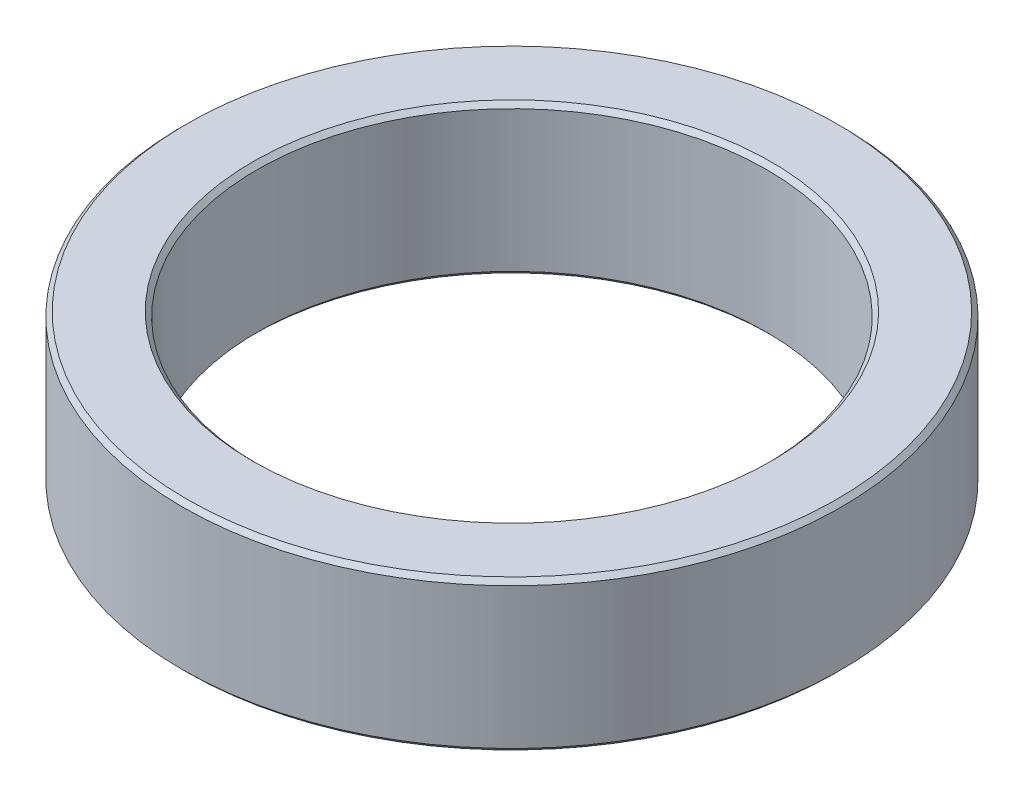
ISO-10303-21;
HEADER;
FILE_DESCRIPTION(('STEP AP214'),'2;1');
FILE_NAME('part.step','',(''),(''),'','','');
FILE_SCHEMA(('AUTOMOTIVE_DESIGN { 1 0 10303 214 1 1 1 1 }'));
ENDSEC;
DATA;
#1=APPLICATION_CONTEXT('core data for automotive mechanical design processes');
#2=APPLICATION_PROTOCOL_DEFINITION('international standard','automotive_design',2000,#1);
#3=PRODUCT_CONTEXT('',#1,'mechanical');
#4=PRODUCT('Part','Part','',(#3));
#5=PRODUCT_RELATED_PRODUCT_CATEGORY('part','',(#4));
#6=PRODUCT_DEFINITION_FORMATION('','',#4);
#7=PRODUCT_DEFINITION_CONTEXT('part definition',#1,'design');
#8=PRODUCT_DEFINITION('design','',#6,#7);
#9=PRODUCT_DEFINITION_SHAPE('','',#8);
#10=(LENGTH_UNIT() NAMED_UNIT(*) SI_UNIT(.MILLI.,.METRE.));
#11=(NAMED_UNIT(*) PLANE_ANGLE_UNIT() SI_UNIT($,.RADIAN.));
#12=(NAMED_UNIT(*) SI_UNIT($,.STERADIAN.) SOLID_ANGLE_UNIT());
#13=UNCERTAINTY_MEASURE_WITH_UNIT(LENGTH_MEASURE(1.E-05),#10,'distance_accuracy_value','');
#14=(GEOMETRIC_REPRESENTATION_CONTEXT(3) GLOBAL_UNCERTAINTY_ASSIGNED_CONTEXT((#13)) GLOBAL_UNIT_ASSIGNED_CONTEXT((#10,
#11,#12)) REPRESENTATION_CONTEXT('',''));
#15=CARTESIAN_POINT('',(0.,0.,0.));
#16=DIRECTION('',(0.,0.,1.));
#17=DIRECTION('',(1.,0.,0.));
#18=AXIS2_PLACEMENT_3D('',#15,#16,#17);
#19=CARTESIAN_POINT('',(0.,5.,0.));
#20=DIRECTION('',(0.,1.,0.));
#21=DIRECTION('',(0.,0.,1.));
#22=AXIS2_PLACEMENT_3D('',#19,#20,#21);
#23=PLANE('',#22);
#24=CARTESIAN_POINT('',(0.,5.,0.));
#25=DIRECTION('',(0.,1.,0.));
#26=DIRECTION('',(0.,0.,1.));
#27=AXIS2_PLACEMENT_3D('',#24,#25,#26);
#28=CIRCLE('',#27,8.65000000000001);
#29=CARTESIAN_POINT('',(0.,5.,8.65000000000001));
#30=VERTEX_POINT('',#29);
#31=EDGE_CURVE('E45',#30,#30,#28,.F.);
#32=ORIENTED_EDGE('',*,*,#31,.T.);
#33=EDGE_LOOP('',(#32));
#34=FACE_BOUND('',#33,.T.);
#35=CARTESIAN_POINT('',(0.,5.,0.));
#36=DIRECTION('',(0.,1.,0.));
#37=DIRECTION('',(0.,0.,1.));
#38=AXIS2_PLACEMENT_3D('',#35,#36,#37);
#39=CIRCLE('',#38,10.845);
#40=CARTESIAN_POINT('',(0.,5.,10.845));
#41=VERTEX_POINT('',#40);
#42=EDGE_CURVE('E49',#41,#41,#39,.T.);
#43=ORIENTED_EDGE('',*,*,#42,.T.);
#44=EDGE_LOOP('',(#43));
#45=FACE_BOUND('',#44,.T.);
#46=ADVANCED_FACE('F33',(#34,#45),#23,.T.);
#47=CARTESIAN_POINT('',(0.,0.,0.));
#48=DIRECTION('',(0.,1.,0.));
#49=DIRECTION('',(0.,0.,1.));
#50=AXIS2_PLACEMENT_3D('',#47,#48,#49);
#51=PLANE('',#50);
#52=CARTESIAN_POINT('',(0.,0.,0.));
#53=DIRECTION('',(0.,1.,0.));
#54=DIRECTION('',(0.,0.,1.));
#55=AXIS2_PLACEMENT_3D('',#52,#53,#54);
#56=CIRCLE('',#55,8.65000000000001);
#57=CARTESIAN_POINT('',(0.,0.,-8.65000000000001));
#58=VERTEX_POINT('',#57);
#59=EDGE_CURVE('E60',#58,#58,#56,.T.);
#60=ORIENTED_EDGE('',*,*,#59,.T.);
#61=EDGE_LOOP('',(#60));
#62=FACE_BOUND('',#61,.T.);
#63=CARTESIAN_POINT('',(0.,0.,0.));
#64=DIRECTION('',(0.,1.,0.));
#65=DIRECTION('',(0.,0.,1.));
#66=AXIS2_PLACEMENT_3D('',#63,#64,#65);
#67=CIRCLE('',#66,10.845);
#68=CARTESIAN_POINT('',(0.,0.,10.845));
#69=VERTEX_POINT('',#68);
#70=EDGE_CURVE('E63',#69,#69,#67,.F.);
#71=ORIENTED_EDGE('',*,*,#70,.T.);
#72=EDGE_LOOP('',(#71));
#73=FACE_BOUND('',#72,.T.);
#74=ADVANCED_FACE('F67',(#62,#73),#51,.F.);
#75=CARTESIAN_POINT('',(0.,5.,0.));
#76=DIRECTION('',(0.,-1.,0.));
#77=DIRECTION('',(0.,0.,-1.));
#78=AXIS2_PLACEMENT_3D('',#75,#76,#77);
#79=CYLINDRICAL_SURFACE('',#78,10.995);
#80=CARTESIAN_POINT('',(0.,0.150000000000001,0.));
#81=DIRECTION('',(0.,1.,0.));
#82=DIRECTION('',(0.,0.,1.));
#83=AXIS2_PLACEMENT_3D('',#80,#81,#82);
#84=CIRCLE('',#83,10.995);
#85=CARTESIAN_POINT('',(0.,0.150000000000001,10.995));
#86=VERTEX_POINT('',#85);
#87=EDGE_CURVE('E10',#86,#86,#84,.T.);
#88=ORIENTED_EDGE('',*,*,#87,.T.);
#89=EDGE_LOOP('',(#88));
#90=FACE_BOUND('',#89,.T.);
#91=CARTESIAN_POINT('',(0.,4.85,0.));
#92=DIRECTION('',(0.,1.,0.));
#93=DIRECTION('',(0.,0.,1.));
#94=AXIS2_PLACEMENT_3D('',#91,#92,#93);
#95=CIRCLE('',#94,10.995);
#96=CARTESIAN_POINT('',(0.,4.85,10.995));
#97=VERTEX_POINT('',#96);
#98=EDGE_CURVE('E41',#97,#97,#95,.F.);
#99=ORIENTED_EDGE('',*,*,#98,.T.);
#100=EDGE_LOOP('',(#99));
#101=FACE_BOUND('',#100,.T.);
#102=ADVANCED_FACE('F88',(#90,#101),#79,.T.);
#103=CARTESIAN_POINT('',(0.,5.,0.));
#104=DIRECTION('',(0.,-1.,0.));
#105=DIRECTION('',(0.,0.,-1.));
#106=AXIS2_PLACEMENT_3D('',#103,#104,#105);
#107=CYLINDRICAL_SURFACE('',#106,8.5);
#108=CARTESIAN_POINT('',(0.,0.150000000000003,0.));
#109=DIRECTION('',(0.,1.,0.));
#110=DIRECTION('',(0.,0.,1.));
#111=AXIS2_PLACEMENT_3D('',#108,#109,#110);
#112=CIRCLE('',#111,8.5);
#113=CARTESIAN_POINT('',(0.,0.150000000000003,-8.5));
#114=VERTEX_POINT('',#113);
#115=EDGE_CURVE('E54',#114,#114,#112,.F.);
#116=ORIENTED_EDGE('',*,*,#115,.T.);
#117=EDGE_LOOP('',(#116));
#118=FACE_BOUND('',#117,.T.);
#119=CARTESIAN_POINT('',(0.,4.85,0.));
#120=DIRECTION('',(0.,1.,0.));
#121=DIRECTION('',(0.,0.,1.));
#122=AXIS2_PLACEMENT_3D('',#119,#120,#121);
#123=CIRCLE('',#122,8.5);
#124=CARTESIAN_POINT('',(0.,4.85,8.5));
#125=VERTEX_POINT('',#124);
#126=EDGE_CURVE('E57',#125,#125,#123,.T.);
#127=ORIENTED_EDGE('',*,*,#126,.T.);
#128=EDGE_LOOP('',(#127));
#129=FACE_BOUND('',#128,.T.);
#130=ADVANCED_FACE('F93',(#118,#129),#107,.F.);
#131=CARTESIAN_POINT('',(0.,0.,0.));
#132=DIRECTION('',(0.,-1.,0.));
#133=DIRECTION('',(0.,0.,-1.));
#134=AXIS2_PLACEMENT_3D('',#131,#132,#133);
#135=CONICAL_SURFACE('',#134,8.65000000000001,0.785398163397454);
#136=CARTESIAN_POINT('',(0.,0.150000000000003,-8.5));
#137=CARTESIAN_POINT('',(0.,0.148437500000002,-8.5015625));
#138=CARTESIAN_POINT('',(0.,0.146875000000002,-8.503125));
#139=CARTESIAN_POINT('',(0.,0.143750000000002,-8.50625));
#140=CARTESIAN_POINT('',(0.,0.142187500000003,-8.5078125));
#141=CARTESIAN_POINT('',(0.,0.139062500000002,-8.5109375));
#142=CARTESIAN_POINT('',(0.,0.137500000000002,-8.5125));
#143=CARTESIAN_POINT('',(0.,0.134375000000002,-8.515625));
#144=CARTESIAN_POINT('',(0.,0.132812500000002,-8.5171875));
#145=CARTESIAN_POINT('',(0.,0.129687500000002,-8.5203125));
#146=CARTESIAN_POINT('',(0.,0.128125000000002,-8.521875));
#147=CARTESIAN_POINT('',(0.,0.125000000000002,-8.525));
#148=CARTESIAN_POINT('',(0.,0.123437500000002,-8.5265625));
#149=CARTESIAN_POINT('',(0.,0.120312500000002,-8.5296875));
#150=CARTESIAN_POINT('',(0.,0.118750000000002,-8.53125));
#151=CARTESIAN_POINT('',(0.,0.115625000000002,-8.534375));
#152=CARTESIAN_POINT('',(0.,0.114062500000002,-8.5359375));
#153=CARTESIAN_POINT('',(0.,0.110937500000002,-8.5390625));
#154=CARTESIAN_POINT('',(0.,0.109375000000002,-8.540625));
#155=CARTESIAN_POINT('',(0.,0.106250000000002,-8.54375));
#156=CARTESIAN_POINT('',(0.,0.104687500000002,-8.5453125));
#157=CARTESIAN_POINT('',(0.,0.101562500000002,-8.5484375));
#158=CARTESIAN_POINT('',(0.,0.100000000000002,-8.55));
#159=CARTESIAN_POINT('',(0.,0.0968750000000015,-8.553125));
#160=CARTESIAN_POINT('',(0.,0.0953125000000014,-8.5546875));
#161=CARTESIAN_POINT('',(0.,0.0921875000000015,-8.5578125));
#162=CARTESIAN_POINT('',(0.,0.0906250000000017,-8.559375));
#163=CARTESIAN_POINT('',(0.,0.0875000000000016,-8.5625));
#164=CARTESIAN_POINT('',(0.,0.0859375000000013,-8.5640625));
#165=CARTESIAN_POINT('',(0.,0.0828125000000012,-8.5671875));
#166=CARTESIAN_POINT('',(0.,0.0812500000000014,-8.56875));
#167=CARTESIAN_POINT('',(0.,0.0781250000000015,-8.571875));
#168=CARTESIAN_POINT('',(0.,0.0765625000000014,-8.5734375));
#169=CARTESIAN_POINT('',(0.,0.0734375000000011,-8.5765625));
#170=CARTESIAN_POINT('',(0.,0.071875000000001,-8.578125));
#171=CARTESIAN_POINT('',(0.,0.0687500000000011,-8.58125));
#172=CARTESIAN_POINT('',(0.,0.0671875000000013,-8.5828125));
#173=CARTESIAN_POINT('',(0.,0.0640625000000012,-8.5859375));
#174=CARTESIAN_POINT('',(0.,0.0625000000000009,-8.5875));
#175=CARTESIAN_POINT('',(0.,0.0593750000000009,-8.590625));
#176=CARTESIAN_POINT('',(0.,0.0578125000000011,-8.5921875));
#177=CARTESIAN_POINT('',(0.,0.0546875000000011,-8.5953125));
#178=CARTESIAN_POINT('',(0.,0.053125000000001,-8.596875));
#179=CARTESIAN_POINT('',(0.,0.0500000000000007,-8.6));
#180=CARTESIAN_POINT('',(0.,0.0484375000000006,-8.6015625));
#181=CARTESIAN_POINT('',(0.,0.0453125000000007,-8.6046875));
#182=CARTESIAN_POINT('',(0.,0.0437500000000008,-8.60625));
#183=CARTESIAN_POINT('',(0.,0.0406250000000009,-8.609375));
#184=CARTESIAN_POINT('',(0.,0.0390625000000008,-8.6109375));
#185=CARTESIAN_POINT('',(0.,0.0359375000000005,-8.6140625));
#186=CARTESIAN_POINT('',(0.,0.0343750000000004,-8.615625));
#187=CARTESIAN_POINT('',(0.,0.0312500000000004,-8.61875));
#188=CARTESIAN_POINT('',(0.,0.0296875000000006,-8.6203125));
#189=CARTESIAN_POINT('',(0.,0.0265625000000006,-8.6234375));
#190=CARTESIAN_POINT('',(0.,0.0250000000000005,-8.625));
#191=CARTESIAN_POINT('',(0.,0.0218750000000003,-8.628125));
#192=CARTESIAN_POINT('',(0.,0.0203125000000001,-8.6296875));
#193=CARTESIAN_POINT('',(0.,0.0171875000000002,-8.6328125));
#194=CARTESIAN_POINT('',(0.,0.0156250000000004,-8.63437500000001));
#195=CARTESIAN_POINT('',(0.,0.0125000000000004,-8.6375));
#196=CARTESIAN_POINT('',(0.,0.0109375000000001,-8.6390625));
#197=CARTESIAN_POINT('',(0.,0.00781249999999995,-8.6421875));
#198=CARTESIAN_POINT('',(0.,0.00625000000000009,-8.64375000000001));
#199=CARTESIAN_POINT('',(0.,0.00312500000000036,-8.646875));
#200=CARTESIAN_POINT('',(0.,0.0015625000000005,-8.64843750000001));
#201=CARTESIAN_POINT('',(0.,0.,-8.65000000000001));
#202=B_SPLINE_CURVE_WITH_KNOTS('',3,(#136,#137,#138,#139,#140,#141,#142,#143,#144,#145,#146,
#147,#148,#149,#150,#151,#152,#153,#154,#155,#156,#157,#158,#159,#160,#161,#162,#163,#164,#165,
#166,#167,#168,#169,#170,#171,#172,#173,#174,#175,#176,#177,#178,#179,#180,#181,#182,#183,#184,
#185,#186,#187,#188,#189,#190,#191,#192,#193,#194,#195,#196,#197,#198,#199,#200,#201),
.UNSPECIFIED.,.F.,.F.,(4,2,2,2,2,2,2,2,2,2,2,2,2,2,2,2,2,2,2,2,2,2,2,2,2,2,2,2,2,2,2,2,4),(0.,
0.00662912607362357,0.0132582521472484,0.0198873782208719,0.0265165042944967,0.0331456303681203,
0.0397747564417439,0.0464038825153687,0.0530330085889923,0.0596621346626158,0.0662912607362406,
0.0729203868098642,0.0795495128834878,0.0861786389571126,0.0928077650307362,0.099436891104361,
0.106066017177985,0.112695143251608,0.119324269325233,0.125953395398857,0.132582521472481,
0.139211647546105,0.145840773619728,0.152469899693353,0.159099025766977,0.1657281518406,
0.172357277914225,0.178986403987849,0.185615530061472,0.192244656135097,0.198873782208721,
0.205502908282346,0.212132034355969),.UNSPECIFIED.);
#203=EDGE_CURVE('BSEAM78',#114,#58,#202,.T.);
#204=ORIENTED_EDGE('',*,*,#115,.F.);
#205=ORIENTED_EDGE('',*,*,#59,.F.);
#206=ORIENTED_EDGE('',*,*,#203,.T.);
#207=ORIENTED_EDGE('',*,*,#203,.F.);
#208=EDGE_LOOP('',(#204,#206,#205,#207));
#209=FACE_BOUND('',#208,.T.);
#210=ADVANCED_FACE('F78',(#209),#135,.F.);
#211=CARTESIAN_POINT('',(0.,4.85,0.));
#212=DIRECTION('',(0.,1.,0.));
#213=DIRECTION('',(0.,0.,1.));
#214=AXIS2_PLACEMENT_3D('',#211,#212,#213);
#215=CONICAL_SURFACE('',#214,8.5,0.78539816339746);
#216=ORIENTED_EDGE('',*,*,#31,.F.);
#217=EDGE_LOOP('',(#216));
#218=FACE_BOUND('',#217,.T.);
#219=ORIENTED_EDGE('',*,*,#126,.F.);
#220=EDGE_LOOP('',(#219));
#221=FACE_BOUND('',#220,.T.);
#222=ADVANCED_FACE('F72',(#218,#221),#215,.F.);
#223=CARTESIAN_POINT('',(0.,0.150000000000001,0.));
#224=DIRECTION('',(0.,1.,0.));
#225=DIRECTION('',(0.,0.,1.));
#226=AXIS2_PLACEMENT_3D('',#223,#224,#225);
#227=CONICAL_SURFACE('',#226,10.995,0.785398163397454);
#228=ORIENTED_EDGE('',*,*,#70,.F.);
#229=EDGE_LOOP('',(#228));
#230=FACE_BOUND('',#229,.T.);
#231=ORIENTED_EDGE('',*,*,#87,.F.);
#232=EDGE_LOOP('',(#231));
#233=FACE_BOUND('',#232,.T.);
#234=ADVANCED_FACE('F69',(#230,#233),#227,.T.);
#235=CARTESIAN_POINT('',(0.,5.,0.));
#236=DIRECTION('',(0.,-1.,0.));
#237=DIRECTION('',(0.,0.,-1.));
#238=AXIS2_PLACEMENT_3D('',#235,#236,#237);
#239=CONICAL_SURFACE('',#238,10.845,0.785398163397471);
#240=ORIENTED_EDGE('',*,*,#98,.F.);
#241=EDGE_LOOP('',(#240));
#242=FACE_BOUND('',#241,.T.);
#243=ORIENTED_EDGE('',*,*,#42,.F.);
#244=EDGE_LOOP('',(#243));
#245=FACE_BOUND('',#244,.T.);
#246=ADVANCED_FACE('F36',(#242,#245),#239,.T.);
#247=CLOSED_SHELL('',(#46,#74,#102,#130,#210,#222,#234,#246));
#248=MANIFOLD_SOLID_BREP('B2',#247);
#249=ADVANCED_BREP_SHAPE_REPRESENTATION('',(#18,#248),#14);
#250=SHAPE_DEFINITION_REPRESENTATION(#9,#249);
ENDSEC;
END-ISO-10303-21;
